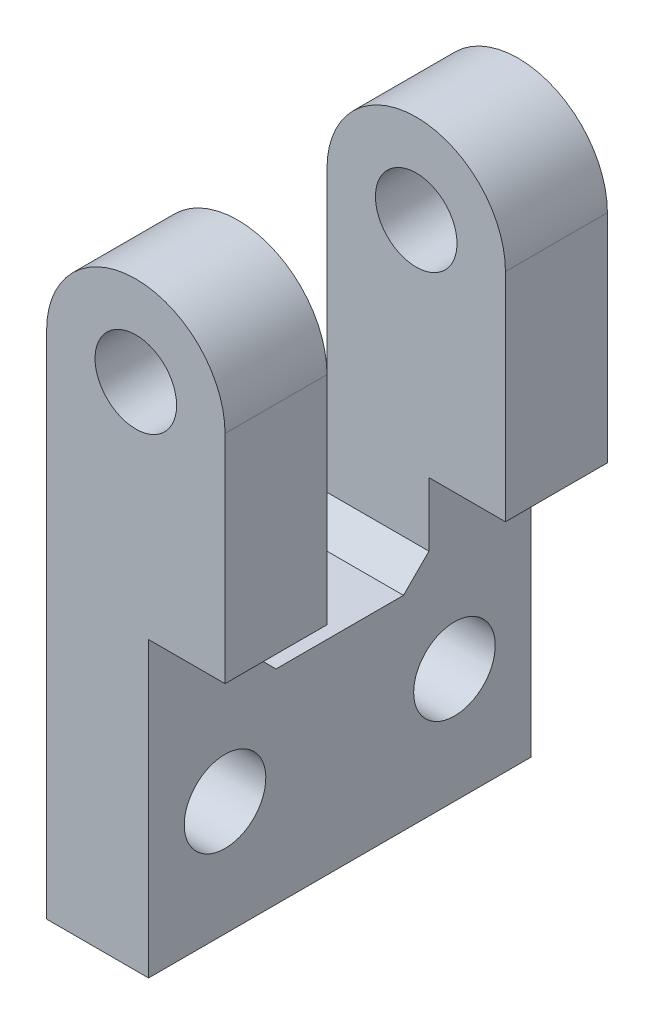
ISO-10303-21;
HEADER;
FILE_DESCRIPTION(('STEP AP214'),'2;1');
FILE_NAME('part.step','',(''),(''),'','','');
FILE_SCHEMA(('AUTOMOTIVE_DESIGN { 1 0 10303 214 1 1 1 1 }'));
ENDSEC;
DATA;
#1=APPLICATION_CONTEXT('core data for automotive mechanical design processes');
#2=APPLICATION_PROTOCOL_DEFINITION('international standard','automotive_design',2000,#1);
#3=PRODUCT_CONTEXT('',#1,'mechanical');
#4=PRODUCT('Part','Part','',(#3));
#5=PRODUCT_RELATED_PRODUCT_CATEGORY('part','',(#4));
#6=PRODUCT_DEFINITION_FORMATION('','',#4);
#7=PRODUCT_DEFINITION_CONTEXT('part definition',#1,'design');
#8=PRODUCT_DEFINITION('design','',#6,#7);
#9=PRODUCT_DEFINITION_SHAPE('','',#8);
#10=(LENGTH_UNIT() NAMED_UNIT(*) SI_UNIT(.MILLI.,.METRE.));
#11=(NAMED_UNIT(*) PLANE_ANGLE_UNIT() SI_UNIT($,.RADIAN.));
#12=(NAMED_UNIT(*) SI_UNIT($,.STERADIAN.) SOLID_ANGLE_UNIT());
#13=UNCERTAINTY_MEASURE_WITH_UNIT(LENGTH_MEASURE(1.E-05),#10,'distance_accuracy_value','');
#14=(GEOMETRIC_REPRESENTATION_CONTEXT(3) GLOBAL_UNCERTAINTY_ASSIGNED_CONTEXT((#13)) GLOBAL_UNIT_ASSIGNED_CONTEXT((#10,
#11,#12)) REPRESENTATION_CONTEXT('',''));
#15=CARTESIAN_POINT('',(0.,0.,0.));
#16=DIRECTION('',(0.,0.,1.));
#17=DIRECTION('',(1.,0.,0.));
#18=AXIS2_PLACEMENT_3D('',#15,#16,#17);
#19=CARTESIAN_POINT('',(3.5,-20.,15.));
#20=DIRECTION('',(-1.,0.,0.));
#21=DIRECTION('',(0.,-1.,0.));
#22=AXIS2_PLACEMENT_3D('',#19,#20,#21);
#23=PLANE('',#22);
#24=DIRECTION('',(0.,1.,0.));
#25=VECTOR('',#24,1.);
#26=CARTESIAN_POINT('',(3.5,-20.,15.));
#27=LINE('',#26,#25);
#28=CARTESIAN_POINT('',(3.5,-8.5,15.));
#29=VERTEX_POINT('',#28);
#30=CARTESIAN_POINT('',(3.5,0.,15.));
#31=VERTEX_POINT('',#30);
#32=EDGE_CURVE('E206',#29,#31,#27,.T.);
#33=ORIENTED_EDGE('',*,*,#32,.F.);
#34=DIRECTION('',(0.,0.,-1.));
#35=VECTOR('',#34,1.);
#36=CARTESIAN_POINT('',(3.5,-8.5,15.));
#37=LINE('',#36,#35);
#38=CARTESIAN_POINT('',(3.5,-8.5,11.));
#39=VERTEX_POINT('',#38);
#40=EDGE_CURVE('E151',#29,#39,#37,.T.);
#41=ORIENTED_EDGE('',*,*,#40,.T.);
#42=DIRECTION('',(0.,1.,0.));
#43=VECTOR('',#42,1.);
#44=CARTESIAN_POINT('',(3.5,6.89928781455862,11.));
#45=LINE('',#44,#43);
#46=CARTESIAN_POINT('',(3.5,0.,11.));
#47=VERTEX_POINT('',#46);
#48=EDGE_CURVE('E183',#39,#47,#45,.T.);
#49=ORIENTED_EDGE('',*,*,#48,.T.);
#50=DIRECTION('',(0.,0.,-1.));
#51=VECTOR('',#50,1.);
#52=CARTESIAN_POINT('',(3.5,0.,15.));
#53=LINE('',#52,#51);
#54=EDGE_CURVE('E230',#31,#47,#53,.T.);
#55=ORIENTED_EDGE('',*,*,#54,.F.);
#56=EDGE_LOOP('',(#33,#41,#49,#55));
#57=FACE_BOUND('',#56,.T.);
#58=ADVANCED_FACE('F34',(#57),#23,.F.);
#59=CARTESIAN_POINT('',(0.,0.,15.));
#60=DIRECTION('',(0.,0.,-1.));
#61=DIRECTION('',(-1.,0.,0.));
#62=AXIS2_PLACEMENT_3D('',#59,#60,#61);
#63=CYLINDRICAL_SURFACE('',#62,3.5);
#64=DIRECTION('',(0.,0.,-1.));
#65=VECTOR('',#64,1.);
#66=CARTESIAN_POINT('',(-3.5,0.,15.));
#67=LINE('',#66,#65);
#68=CARTESIAN_POINT('',(-3.5,0.,4.));
#69=VERTEX_POINT('',#68);
#70=CARTESIAN_POINT('',(-3.5,0.,0.));
#71=VERTEX_POINT('',#70);
#72=EDGE_CURVE('E225',#69,#71,#67,.T.);
#73=ORIENTED_EDGE('',*,*,#72,.F.);
#74=CARTESIAN_POINT('',(0.,0.,4.));
#75=DIRECTION('',(0.,0.,-1.));
#76=DIRECTION('',(0.,1.,0.));
#77=AXIS2_PLACEMENT_3D('',#74,#75,#76);
#78=CIRCLE('',#77,3.5);
#79=CARTESIAN_POINT('',(3.5,0.,4.));
#80=VERTEX_POINT('',#79);
#81=EDGE_CURVE('E196',#69,#80,#78,.T.);
#82=ORIENTED_EDGE('',*,*,#81,.T.);
#83=CARTESIAN_POINT('',(3.5,0.,0.));
#84=VERTEX_POINT('',#83);
#85=EDGE_CURVE('E229',#80,#84,#53,.T.);
#86=ORIENTED_EDGE('',*,*,#85,.T.);
#87=CARTESIAN_POINT('',(0.,0.,0.));
#88=DIRECTION('',(0.,0.,1.));
#89=DIRECTION('',(1.,0.,0.));
#90=AXIS2_PLACEMENT_3D('',#87,#88,#89);
#91=CIRCLE('',#90,3.5);
#92=EDGE_CURVE('E216',#84,#71,#91,.T.);
#93=ORIENTED_EDGE('',*,*,#92,.T.);
#94=EDGE_LOOP('',(#73,#82,#86,#93));
#95=FACE_BOUND('',#94,.T.);
#96=ADVANCED_FACE('F297',(#95),#63,.T.);
#97=CARTESIAN_POINT('',(0.,0.,15.));
#98=DIRECTION('',(0.,0.,-1.));
#99=DIRECTION('',(-1.,0.,0.));
#100=AXIS2_PLACEMENT_3D('',#97,#98,#99);
#101=CYLINDRICAL_SURFACE('',#100,1.6);
#102=CARTESIAN_POINT('',(0.,0.,4.));
#103=DIRECTION('',(0.,0.,-1.));
#104=DIRECTION('',(0.,1.,0.));
#105=AXIS2_PLACEMENT_3D('',#102,#103,#104);
#106=CIRCLE('',#105,1.6);
#107=CARTESIAN_POINT('',(0.,1.6,4.));
#108=VERTEX_POINT('',#107);
#109=EDGE_CURVE('E195',#108,#108,#106,.T.);
#110=ORIENTED_EDGE('',*,*,#109,.F.);
#111=EDGE_LOOP('',(#110));
#112=FACE_BOUND('',#111,.T.);
#113=CARTESIAN_POINT('',(0.,0.,0.));
#114=DIRECTION('',(0.,0.,1.));
#115=DIRECTION('',(1.,0.,0.));
#116=AXIS2_PLACEMENT_3D('',#113,#114,#115);
#117=CIRCLE('',#116,1.6);
#118=CARTESIAN_POINT('',(1.6,0.,0.));
#119=VERTEX_POINT('',#118);
#120=EDGE_CURVE('E199',#119,#119,#117,.T.);
#121=ORIENTED_EDGE('',*,*,#120,.F.);
#122=EDGE_LOOP('',(#121));
#123=FACE_BOUND('',#122,.T.);
#124=ADVANCED_FACE('F311',(#112,#123),#101,.F.);
#125=CARTESIAN_POINT('',(0.,0.,15.));
#126=DIRECTION('',(0.,0.,1.));
#127=DIRECTION('',(1.,0.,0.));
#128=AXIS2_PLACEMENT_3D('',#125,#126,#127);
#129=PLANE('',#128);
#130=DIRECTION('',(0.,1.,0.));
#131=VECTOR('',#130,1.);
#132=CARTESIAN_POINT('',(0.5,-25.5,15.));
#133=LINE('',#132,#131);
#134=CARTESIAN_POINT('',(0.5,-20.,15.));
#135=VERTEX_POINT('',#134);
#136=CARTESIAN_POINT('',(0.5,-8.5,15.));
#137=VERTEX_POINT('',#136);
#138=EDGE_CURVE('E138',#135,#137,#133,.T.);
#139=ORIENTED_EDGE('',*,*,#138,.T.);
#140=DIRECTION('',(1.,0.,0.));
#141=VECTOR('',#140,1.);
#142=CARTESIAN_POINT('',(3.5,-8.5,15.));
#143=LINE('',#142,#141);
#144=EDGE_CURVE('E148',#137,#29,#143,.T.);
#145=ORIENTED_EDGE('',*,*,#144,.T.);
#146=ORIENTED_EDGE('',*,*,#32,.T.);
#147=CARTESIAN_POINT('',(0.,0.,15.));
#148=DIRECTION('',(0.,0.,1.));
#149=DIRECTION('',(1.,0.,0.));
#150=AXIS2_PLACEMENT_3D('',#147,#148,#149);
#151=CIRCLE('',#150,3.5);
#152=CARTESIAN_POINT('',(-3.5,0.,15.));
#153=VERTEX_POINT('',#152);
#154=EDGE_CURVE('E208',#31,#153,#151,.T.);
#155=ORIENTED_EDGE('',*,*,#154,.T.);
#156=DIRECTION('',(0.,-1.,0.));
#157=VECTOR('',#156,1.);
#158=CARTESIAN_POINT('',(-3.5,-20.,15.));
#159=LINE('',#158,#157);
#160=CARTESIAN_POINT('',(-3.5,-20.,15.));
#161=VERTEX_POINT('',#160);
#162=EDGE_CURVE('E211',#153,#161,#159,.T.);
#163=ORIENTED_EDGE('',*,*,#162,.T.);
#164=DIRECTION('',(1.,0.,0.));
#165=VECTOR('',#164,1.);
#166=CARTESIAN_POINT('',(-3.5,-20.,15.));
#167=LINE('',#166,#165);
#168=EDGE_CURVE('E159',#161,#135,#167,.T.);
#169=ORIENTED_EDGE('',*,*,#168,.T.);
#170=EDGE_LOOP('',(#139,#145,#146,#155,#163,#169));
#171=FACE_BOUND('',#170,.T.);
#172=CARTESIAN_POINT('',(0.,0.,15.));
#173=DIRECTION('',(0.,0.,1.));
#174=DIRECTION('',(1.,0.,0.));
#175=AXIS2_PLACEMENT_3D('',#172,#173,#174);
#176=CIRCLE('',#175,1.6);
#177=CARTESIAN_POINT('',(1.6,0.,15.));
#178=VERTEX_POINT('',#177);
#179=EDGE_CURVE('E200',#178,#178,#176,.T.);
#180=ORIENTED_EDGE('',*,*,#179,.F.);
#181=EDGE_LOOP('',(#180));
#182=FACE_BOUND('',#181,.T.);
#183=ADVANCED_FACE('F156',(#171,#182),#129,.T.);
#184=CARTESIAN_POINT('',(0.,0.,0.));
#185=DIRECTION('',(0.,0.,1.));
#186=DIRECTION('',(1.,0.,0.));
#187=AXIS2_PLACEMENT_3D('',#184,#185,#186);
#188=PLANE('',#187);
#189=DIRECTION('',(1.,0.,0.));
#190=VECTOR('',#189,1.);
#191=CARTESIAN_POINT('',(3.5,-8.5,0.));
#192=LINE('',#191,#190);
#193=CARTESIAN_POINT('',(0.5,-8.5,0.));
#194=VERTEX_POINT('',#193);
#195=CARTESIAN_POINT('',(3.5,-8.5,0.));
#196=VERTEX_POINT('',#195);
#197=EDGE_CURVE('E160',#194,#196,#192,.T.);
#198=ORIENTED_EDGE('',*,*,#197,.F.);
#199=DIRECTION('',(0.,1.,0.));
#200=VECTOR('',#199,1.);
#201=CARTESIAN_POINT('',(0.5,-25.5,0.));
#202=LINE('',#201,#200);
#203=CARTESIAN_POINT('',(0.5,-20.,0.));
#204=VERTEX_POINT('',#203);
#205=EDGE_CURVE('E162',#204,#194,#202,.T.);
#206=ORIENTED_EDGE('',*,*,#205,.F.);
#207=DIRECTION('',(1.,0.,0.));
#208=VECTOR('',#207,1.);
#209=CARTESIAN_POINT('',(-3.5,-20.,0.));
#210=LINE('',#209,#208);
#211=CARTESIAN_POINT('',(-3.5,-20.,0.));
#212=VERTEX_POINT('',#211);
#213=EDGE_CURVE('E209',#212,#204,#210,.T.);
#214=ORIENTED_EDGE('',*,*,#213,.F.);
#215=DIRECTION('',(0.,-1.,0.));
#216=VECTOR('',#215,1.);
#217=CARTESIAN_POINT('',(-3.5,-20.,0.));
#218=LINE('',#217,#216);
#219=EDGE_CURVE('E219',#71,#212,#218,.T.);
#220=ORIENTED_EDGE('',*,*,#219,.F.);
#221=ORIENTED_EDGE('',*,*,#92,.F.);
#222=DIRECTION('',(0.,1.,0.));
#223=VECTOR('',#222,1.);
#224=CARTESIAN_POINT('',(3.5,-20.,0.));
#225=LINE('',#224,#223);
#226=EDGE_CURVE('E203',#196,#84,#225,.T.);
#227=ORIENTED_EDGE('',*,*,#226,.F.);
#228=EDGE_LOOP('',(#198,#206,#214,#220,#221,#227));
#229=FACE_BOUND('',#228,.T.);
#230=ORIENTED_EDGE('',*,*,#120,.T.);
#231=EDGE_LOOP('',(#230));
#232=FACE_BOUND('',#231,.T.);
#233=ADVANCED_FACE('F290',(#229,#232),#188,.F.);
#234=DIRECTION('',(0.,-1.,0.));
#235=VECTOR('',#234,1.);
#236=CARTESIAN_POINT('',(3.5,6.89928781455862,4.));
#237=LINE('',#236,#235);
#238=CARTESIAN_POINT('',(3.5,-8.5,4.));
#239=VERTEX_POINT('',#238);
#240=EDGE_CURVE('E180',#80,#239,#237,.T.);
#241=ORIENTED_EDGE('',*,*,#240,.T.);
#242=EDGE_CURVE('E144',#239,#196,#37,.T.);
#243=ORIENTED_EDGE('',*,*,#242,.T.);
#244=ORIENTED_EDGE('',*,*,#226,.T.);
#245=ORIENTED_EDGE('',*,*,#85,.F.);
#246=EDGE_LOOP('',(#241,#243,#244,#245));
#247=FACE_BOUND('',#246,.T.);
#248=ADVANCED_FACE('F285',(#247),#23,.F.);
#249=ORIENTED_EDGE('',*,*,#54,.T.);
#250=CARTESIAN_POINT('',(0.,0.,11.));
#251=DIRECTION('',(0.,0.,1.));
#252=DIRECTION('',(0.,-1.,0.));
#253=AXIS2_PLACEMENT_3D('',#250,#251,#252);
#254=CIRCLE('',#253,3.5);
#255=CARTESIAN_POINT('',(-3.5,0.,11.));
#256=VERTEX_POINT('',#255);
#257=EDGE_CURVE('E192',#47,#256,#254,.T.);
#258=ORIENTED_EDGE('',*,*,#257,.T.);
#259=EDGE_CURVE('E226',#153,#256,#67,.T.);
#260=ORIENTED_EDGE('',*,*,#259,.F.);
#261=ORIENTED_EDGE('',*,*,#154,.F.);
#262=EDGE_LOOP('',(#249,#258,#260,#261));
#263=FACE_BOUND('',#262,.T.);
#264=ADVANCED_FACE('F312',(#263),#63,.T.);
#265=CARTESIAN_POINT('',(-3.5,-20.,15.));
#266=DIRECTION('',(1.,0.,0.));
#267=DIRECTION('',(0.,1.,0.));
#268=AXIS2_PLACEMENT_3D('',#265,#266,#267);
#269=PLANE('',#268);
#270=CARTESIAN_POINT('',(-3.5,-15.5,3.));
#271=DIRECTION('',(-1.,0.,0.));
#272=DIRECTION('',(0.,-1.,0.));
#273=AXIS2_PLACEMENT_3D('',#270,#271,#272);
#274=CIRCLE('',#273,1.6);
#275=CARTESIAN_POINT('',(-3.5,-17.1,3.));
#276=VERTEX_POINT('',#275);
#277=EDGE_CURVE('E248',#276,#276,#274,.T.);
#278=ORIENTED_EDGE('',*,*,#277,.F.);
#279=EDGE_LOOP('',(#278));
#280=FACE_BOUND('',#279,.T.);
#281=CARTESIAN_POINT('',(-3.5,-15.5,12.));
#282=DIRECTION('',(-1.,0.,0.));
#283=DIRECTION('',(0.,-1.,0.));
#284=AXIS2_PLACEMENT_3D('',#281,#282,#283);
#285=CIRCLE('',#284,1.6);
#286=CARTESIAN_POINT('',(-3.5,-17.1,12.));
#287=VERTEX_POINT('',#286);
#288=EDGE_CURVE('E165',#287,#287,#285,.T.);
#289=ORIENTED_EDGE('',*,*,#288,.F.);
#290=EDGE_LOOP('',(#289));
#291=FACE_BOUND('',#290,.T.);
#292=DIRECTION('',(0.,0.,1.));
#293=VECTOR('',#292,1.);
#294=CARTESIAN_POINT('',(-3.5,-12.,4.));
#295=LINE('',#294,#293);
#296=CARTESIAN_POINT('',(-3.5,-12.,5.00000000000001));
#297=VERTEX_POINT('',#296);
#298=CARTESIAN_POINT('',(-3.5,-12.,10.));
#299=VERTEX_POINT('',#298);
#300=EDGE_CURVE('E188',#297,#299,#295,.T.);
#301=ORIENTED_EDGE('',*,*,#300,.F.);
#302=DIRECTION('',(0.,-0.707106781186544,0.707106781186551));
#303=VECTOR('',#302,1.);
#304=CARTESIAN_POINT('',(-3.5,-21.,14.0000000000001));
#305=LINE('',#304,#303);
#306=CARTESIAN_POINT('',(-3.5,-11.,4.));
#307=VERTEX_POINT('',#306);
#308=EDGE_CURVE('E42',#297,#307,#305,.F.);
#309=ORIENTED_EDGE('',*,*,#308,.T.);
#310=DIRECTION('',(0.,-1.,0.));
#311=VECTOR('',#310,1.);
#312=CARTESIAN_POINT('',(-3.5,6.89928781455862,4.));
#313=LINE('',#312,#311);
#314=EDGE_CURVE('E179',#69,#307,#313,.T.);
#315=ORIENTED_EDGE('',*,*,#314,.F.);
#316=ORIENTED_EDGE('',*,*,#72,.T.);
#317=ORIENTED_EDGE('',*,*,#219,.T.);
#318=DIRECTION('',(0.,0.,-1.));
#319=VECTOR('',#318,1.);
#320=CARTESIAN_POINT('',(-3.5,-20.,15.));
#321=LINE('',#320,#319);
#322=EDGE_CURVE('E214',#161,#212,#321,.T.);
#323=ORIENTED_EDGE('',*,*,#322,.F.);
#324=ORIENTED_EDGE('',*,*,#162,.F.);
#325=ORIENTED_EDGE('',*,*,#259,.T.);
#326=DIRECTION('',(0.,1.,0.));
#327=VECTOR('',#326,1.);
#328=CARTESIAN_POINT('',(-3.5,6.89928781455862,11.));
#329=LINE('',#328,#327);
#330=CARTESIAN_POINT('',(-3.5,-11.,11.));
#331=VERTEX_POINT('',#330);
#332=EDGE_CURVE('E184',#331,#256,#329,.T.);
#333=ORIENTED_EDGE('',*,*,#332,.F.);
#334=DIRECTION('',(0.,0.707106781186551,0.707106781186544));
#335=VECTOR('',#334,1.);
#336=CARTESIAN_POINT('',(-3.5,-13.5,8.49999999999998));
#337=LINE('',#336,#335);
#338=EDGE_CURVE('E257',#331,#299,#337,.F.);
#339=ORIENTED_EDGE('',*,*,#338,.T.);
#340=EDGE_LOOP('',(#301,#309,#315,#316,#317,#323,#324,#325,#333,#339));
#341=FACE_BOUND('',#340,.T.);
#342=ADVANCED_FACE('F270',(#280,#291,#341),#269,.F.);
#343=CARTESIAN_POINT('',(-3.5,-20.,15.));
#344=DIRECTION('',(0.,1.,0.));
#345=DIRECTION('',(0.,0.,1.));
#346=AXIS2_PLACEMENT_3D('',#343,#344,#345);
#347=PLANE('',#346);
#348=ORIENTED_EDGE('',*,*,#213,.T.);
#349=DIRECTION('',(0.,0.,1.));
#350=VECTOR('',#349,1.);
#351=CARTESIAN_POINT('',(0.5,-20.,15.));
#352=LINE('',#351,#350);
#353=EDGE_CURVE('E174',#204,#135,#352,.T.);
#354=ORIENTED_EDGE('',*,*,#353,.T.);
#355=ORIENTED_EDGE('',*,*,#168,.F.);
#356=ORIENTED_EDGE('',*,*,#322,.T.);
#357=EDGE_LOOP('',(#348,#354,#355,#356));
#358=FACE_BOUND('',#357,.T.);
#359=ADVANCED_FACE('F301',(#358),#347,.F.);
#360=CARTESIAN_POINT('',(0.,0.,11.));
#361=DIRECTION('',(0.,0.,1.));
#362=DIRECTION('',(0.,-1.,0.));
#363=AXIS2_PLACEMENT_3D('',#360,#361,#362);
#364=CIRCLE('',#363,1.6);
#365=CARTESIAN_POINT('',(0.,-1.6,11.));
#366=VERTEX_POINT('',#365);
#367=EDGE_CURVE('E186',#366,#366,#364,.T.);
#368=ORIENTED_EDGE('',*,*,#367,.F.);
#369=EDGE_LOOP('',(#368));
#370=FACE_BOUND('',#369,.T.);
#371=ORIENTED_EDGE('',*,*,#179,.T.);
#372=EDGE_LOOP('',(#371));
#373=FACE_BOUND('',#372,.T.);
#374=ADVANCED_FACE('F303',(#370,#373),#101,.F.);
#375=CARTESIAN_POINT('',(3.5,6.89928781455862,4.));
#376=DIRECTION('',(0.,0.,-1.));
#377=DIRECTION('',(0.,1.,0.));
#378=AXIS2_PLACEMENT_3D('',#375,#376,#377);
#379=PLANE('',#378);
#380=ORIENTED_EDGE('',*,*,#109,.T.);
#381=EDGE_LOOP('',(#380));
#382=FACE_BOUND('',#381,.T.);
#383=ORIENTED_EDGE('',*,*,#314,.T.);
#384=DIRECTION('',(1.,0.,0.));
#385=VECTOR('',#384,1.);
#386=CARTESIAN_POINT('',(0.5,-11.,4.));
#387=LINE('',#386,#385);
#388=CARTESIAN_POINT('',(0.5,-11.,4.));
#389=VERTEX_POINT('',#388);
#390=EDGE_CURVE('E55',#307,#389,#387,.T.);
#391=ORIENTED_EDGE('',*,*,#390,.T.);
#392=DIRECTION('',(0.,1.,0.));
#393=VECTOR('',#392,1.);
#394=CARTESIAN_POINT('',(0.5,6.89928781455862,4.));
#395=LINE('',#394,#393);
#396=CARTESIAN_POINT('',(0.5,-8.5,4.));
#397=VERTEX_POINT('',#396);
#398=EDGE_CURVE('E172',#389,#397,#395,.T.);
#399=ORIENTED_EDGE('',*,*,#398,.T.);
#400=DIRECTION('',(1.,0.,0.));
#401=VECTOR('',#400,1.);
#402=CARTESIAN_POINT('',(3.5,-8.5,4.));
#403=LINE('',#402,#401);
#404=EDGE_CURVE('E176',#397,#239,#403,.T.);
#405=ORIENTED_EDGE('',*,*,#404,.T.);
#406=ORIENTED_EDGE('',*,*,#240,.F.);
#407=ORIENTED_EDGE('',*,*,#81,.F.);
#408=EDGE_LOOP('',(#383,#391,#399,#405,#406,#407));
#409=FACE_BOUND('',#408,.T.);
#410=ADVANCED_FACE('F278',(#382,#409),#379,.F.);
#411=CARTESIAN_POINT('',(3.5,6.89928781455862,11.));
#412=DIRECTION('',(0.,0.,1.));
#413=DIRECTION('',(0.,-1.,0.));
#414=AXIS2_PLACEMENT_3D('',#411,#412,#413);
#415=PLANE('',#414);
#416=ORIENTED_EDGE('',*,*,#367,.T.);
#417=EDGE_LOOP('',(#416));
#418=FACE_BOUND('',#417,.T.);
#419=DIRECTION('',(0.,-1.,0.));
#420=VECTOR('',#419,1.);
#421=CARTESIAN_POINT('',(0.5,6.89928781455862,11.));
#422=LINE('',#421,#420);
#423=CARTESIAN_POINT('',(0.5,-8.5,11.));
#424=VERTEX_POINT('',#423);
#425=CARTESIAN_POINT('',(0.5,-11.,11.));
#426=VERTEX_POINT('',#425);
#427=EDGE_CURVE('E141',#424,#426,#422,.T.);
#428=ORIENTED_EDGE('',*,*,#427,.T.);
#429=DIRECTION('',(-1.,0.,0.));
#430=VECTOR('',#429,1.);
#431=CARTESIAN_POINT('',(-3.5,-11.,11.));
#432=LINE('',#431,#430);
#433=EDGE_CURVE('E242',#426,#331,#432,.T.);
#434=ORIENTED_EDGE('',*,*,#433,.T.);
#435=ORIENTED_EDGE('',*,*,#332,.T.);
#436=ORIENTED_EDGE('',*,*,#257,.F.);
#437=ORIENTED_EDGE('',*,*,#48,.F.);
#438=DIRECTION('',(-1.,0.,0.));
#439=VECTOR('',#438,1.);
#440=CARTESIAN_POINT('',(3.5,-8.5,11.));
#441=LINE('',#440,#439);
#442=EDGE_CURVE('E240',#39,#424,#441,.T.);
#443=ORIENTED_EDGE('',*,*,#442,.T.);
#444=EDGE_LOOP('',(#428,#434,#435,#436,#437,#443));
#445=FACE_BOUND('',#444,.T.);
#446=ADVANCED_FACE('F266',(#418,#445),#415,.F.);
#447=CARTESIAN_POINT('',(3.5,-12.,4.));
#448=DIRECTION('',(0.,-1.,0.));
#449=DIRECTION('',(0.,0.,-1.));
#450=AXIS2_PLACEMENT_3D('',#447,#448,#449);
#451=PLANE('',#450);
#452=ORIENTED_EDGE('',*,*,#300,.T.);
#453=DIRECTION('',(1.,0.,0.));
#454=VECTOR('',#453,1.);
#455=CARTESIAN_POINT('',(0.5,-12.,10.));
#456=LINE('',#455,#454);
#457=CARTESIAN_POINT('',(0.5,-12.,10.));
#458=VERTEX_POINT('',#457);
#459=EDGE_CURVE('E254',#299,#458,#456,.T.);
#460=ORIENTED_EDGE('',*,*,#459,.T.);
#461=DIRECTION('',(0.,0.,-1.));
#462=VECTOR('',#461,1.);
#463=CARTESIAN_POINT('',(0.5,-12.,4.));
#464=LINE('',#463,#462);
#465=CARTESIAN_POINT('',(0.5,-12.,5.00000000000001));
#466=VERTEX_POINT('',#465);
#467=EDGE_CURVE('E233',#458,#466,#464,.T.);
#468=ORIENTED_EDGE('',*,*,#467,.T.);
#469=DIRECTION('',(-1.,0.,0.));
#470=VECTOR('',#469,1.);
#471=CARTESIAN_POINT('',(-3.5,-12.,5.00000000000001));
#472=LINE('',#471,#470);
#473=EDGE_CURVE('E251',#466,#297,#472,.T.);
#474=ORIENTED_EDGE('',*,*,#473,.T.);
#475=EDGE_LOOP('',(#452,#460,#468,#474));
#476=FACE_BOUND('',#475,.T.);
#477=ADVANCED_FACE('F272',(#476),#451,.F.);
#478=CARTESIAN_POINT('',(3.5,-8.5,15.));
#479=DIRECTION('',(0.,1.,0.));
#480=DIRECTION('',(0.,0.,1.));
#481=AXIS2_PLACEMENT_3D('',#478,#479,#480);
#482=PLANE('',#481);
#483=DIRECTION('',(0.,0.,-1.));
#484=VECTOR('',#483,1.);
#485=CARTESIAN_POINT('',(0.5,-8.5,15.));
#486=LINE('',#485,#484);
#487=EDGE_CURVE('E145',#397,#194,#486,.T.);
#488=ORIENTED_EDGE('',*,*,#487,.T.);
#489=ORIENTED_EDGE('',*,*,#197,.T.);
#490=ORIENTED_EDGE('',*,*,#242,.F.);
#491=ORIENTED_EDGE('',*,*,#404,.F.);
#492=EDGE_LOOP('',(#488,#489,#490,#491));
#493=FACE_BOUND('',#492,.T.);
#494=ADVANCED_FACE('F280',(#493),#482,.F.);
#495=ORIENTED_EDGE('',*,*,#40,.F.);
#496=ORIENTED_EDGE('',*,*,#144,.F.);
#497=EDGE_CURVE('E133',#137,#424,#486,.T.);
#498=ORIENTED_EDGE('',*,*,#497,.T.);
#499=ORIENTED_EDGE('',*,*,#442,.F.);
#500=EDGE_LOOP('',(#495,#496,#498,#499));
#501=FACE_BOUND('',#500,.T.);
#502=ADVANCED_FACE('F149',(#501),#482,.F.);
#503=CARTESIAN_POINT('',(0.5,-25.5,15.));
#504=DIRECTION('',(-1.,0.,0.));
#505=DIRECTION('',(0.,0.,1.));
#506=AXIS2_PLACEMENT_3D('',#503,#504,#505);
#507=PLANE('',#506);
#508=CARTESIAN_POINT('',(0.5,-15.5,3.));
#509=DIRECTION('',(-1.,0.,0.));
#510=DIRECTION('',(0.,0.,1.));
#511=AXIS2_PLACEMENT_3D('',#508,#509,#510);
#512=CIRCLE('',#511,1.6);
#513=CARTESIAN_POINT('',(0.5,-15.5,4.6));
#514=VERTEX_POINT('',#513);
#515=EDGE_CURVE('E245',#514,#514,#512,.T.);
#516=ORIENTED_EDGE('',*,*,#515,.T.);
#517=EDGE_LOOP('',(#516));
#518=FACE_BOUND('',#517,.T.);
#519=CARTESIAN_POINT('',(0.5,-15.5,12.));
#520=DIRECTION('',(-1.,0.,0.));
#521=DIRECTION('',(0.,0.,1.));
#522=AXIS2_PLACEMENT_3D('',#519,#520,#521);
#523=CIRCLE('',#522,1.6);
#524=CARTESIAN_POINT('',(0.5,-15.5,13.6));
#525=VERTEX_POINT('',#524);
#526=EDGE_CURVE('E168',#525,#525,#523,.T.);
#527=ORIENTED_EDGE('',*,*,#526,.T.);
#528=EDGE_LOOP('',(#527));
#529=FACE_BOUND('',#528,.T.);
#530=ORIENTED_EDGE('',*,*,#205,.T.);
#531=ORIENTED_EDGE('',*,*,#487,.F.);
#532=ORIENTED_EDGE('',*,*,#398,.F.);
#533=DIRECTION('',(0.,0.707106781186544,-0.707106781186551));
#534=VECTOR('',#533,1.);
#535=CARTESIAN_POINT('',(0.5,-23.7499999999999,16.7500000000001));
#536=LINE('',#535,#534);
#537=EDGE_CURVE('E11',#389,#466,#536,.F.);
#538=ORIENTED_EDGE('',*,*,#537,.T.);
#539=ORIENTED_EDGE('',*,*,#467,.F.);
#540=DIRECTION('',(0.,-0.707106781186551,-0.707106781186544));
#541=VECTOR('',#540,1.);
#542=CARTESIAN_POINT('',(0.5,-16.2500000000001,5.74999999999997));
#543=LINE('',#542,#541);
#544=EDGE_CURVE('E259',#458,#426,#543,.F.);
#545=ORIENTED_EDGE('',*,*,#544,.T.);
#546=ORIENTED_EDGE('',*,*,#427,.F.);
#547=ORIENTED_EDGE('',*,*,#497,.F.);
#548=ORIENTED_EDGE('',*,*,#138,.F.);
#549=ORIENTED_EDGE('',*,*,#353,.F.);
#550=EDGE_LOOP('',(#530,#531,#532,#538,#539,#545,#546,#547,#548,#549));
#551=FACE_BOUND('',#550,.T.);
#552=ADVANCED_FACE('F136',(#518,#529,#551),#507,.F.);
#553=CARTESIAN_POINT('',(6.5,-15.5,12.));
#554=DIRECTION('',(-1.,0.,0.));
#555=DIRECTION('',(0.,-1.,0.));
#556=AXIS2_PLACEMENT_3D('',#553,#554,#555);
#557=CYLINDRICAL_SURFACE('',#556,1.6);
#558=ORIENTED_EDGE('',*,*,#288,.T.);
#559=EDGE_LOOP('',(#558));
#560=FACE_BOUND('',#559,.T.);
#561=ORIENTED_EDGE('',*,*,#526,.F.);
#562=EDGE_LOOP('',(#561));
#563=FACE_BOUND('',#562,.T.);
#564=ADVANCED_FACE('F344',(#560,#563),#557,.F.);
#565=CARTESIAN_POINT('',(6.5,-15.5,3.));
#566=DIRECTION('',(-1.,0.,0.));
#567=DIRECTION('',(0.,-1.,0.));
#568=AXIS2_PLACEMENT_3D('',#565,#566,#567);
#569=CYLINDRICAL_SURFACE('',#568,1.6);
#570=ORIENTED_EDGE('',*,*,#277,.T.);
#571=EDGE_LOOP('',(#570));
#572=FACE_BOUND('',#571,.T.);
#573=ORIENTED_EDGE('',*,*,#515,.F.);
#574=EDGE_LOOP('',(#573));
#575=FACE_BOUND('',#574,.T.);
#576=ADVANCED_FACE('F350',(#572,#575),#569,.F.);
#577=CARTESIAN_POINT('',(3.5,-11.,11.));
#578=DIRECTION('',(0.,0.707106781186544,-0.707106781186551));
#579=DIRECTION('',(1.,0.,0.));
#580=AXIS2_PLACEMENT_3D('',#577,#578,#579);
#581=PLANE('',#580);
#582=ORIENTED_EDGE('',*,*,#544,.F.);
#583=ORIENTED_EDGE('',*,*,#459,.F.);
#584=ORIENTED_EDGE('',*,*,#338,.F.);
#585=ORIENTED_EDGE('',*,*,#433,.F.);
#586=EDGE_LOOP('',(#582,#583,#584,#585));
#587=FACE_BOUND('',#586,.T.);
#588=ADVANCED_FACE('F269',(#587),#581,.T.);
#589=CARTESIAN_POINT('',(3.5,-12.,5.00000000000001));
#590=DIRECTION('',(0.,0.707106781186551,0.707106781186544));
#591=DIRECTION('',(1.,0.,0.));
#592=AXIS2_PLACEMENT_3D('',#589,#590,#591);
#593=PLANE('',#592);
#594=ORIENTED_EDGE('',*,*,#537,.F.);
#595=ORIENTED_EDGE('',*,*,#390,.F.);
#596=ORIENTED_EDGE('',*,*,#308,.F.);
#597=ORIENTED_EDGE('',*,*,#473,.F.);
#598=EDGE_LOOP('',(#594,#595,#596,#597));
#599=FACE_BOUND('',#598,.T.);
#600=ADVANCED_FACE('F36',(#599),#593,.T.);
#601=CLOSED_SHELL('',(#58,#96,#124,#183,#233,#248,#264,#342,#359,#374,#410,#446,#477,#494,#502,
#552,#564,#576,#588,#600));
#602=MANIFOLD_SOLID_BREP('B2',#601);
#603=ADVANCED_BREP_SHAPE_REPRESENTATION('',(#18,#602),#14);
#604=SHAPE_DEFINITION_REPRESENTATION(#9,#603);
ENDSEC;
END-ISO-10303-21;
